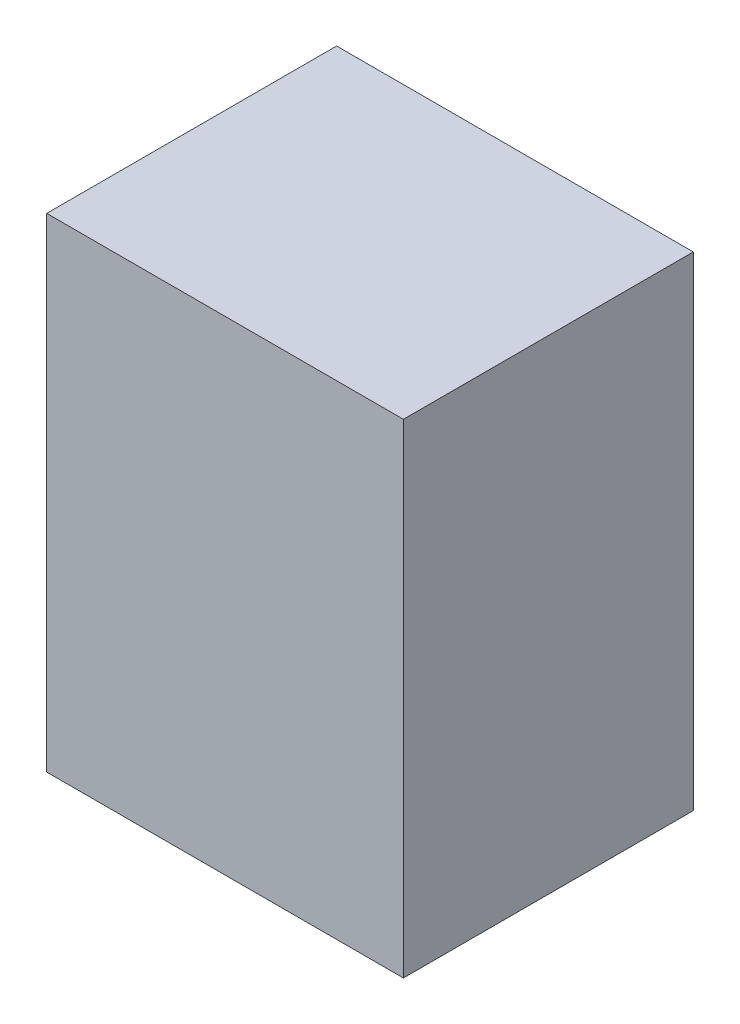
ISO-10303-21;
HEADER;
FILE_DESCRIPTION(('STEP AP214'),'2;1');
FILE_NAME('part.step','',(''),(''),'','','');
FILE_SCHEMA(('AUTOMOTIVE_DESIGN { 1 0 10303 214 1 1 1 1 }'));
ENDSEC;
DATA;
#1=APPLICATION_CONTEXT('core data for automotive mechanical design processes');
#2=APPLICATION_PROTOCOL_DEFINITION('international standard','automotive_design',2000,#1);
#3=PRODUCT_CONTEXT('',#1,'mechanical');
#4=PRODUCT('Part','Part','',(#3));
#5=PRODUCT_RELATED_PRODUCT_CATEGORY('part','',(#4));
#6=PRODUCT_DEFINITION_FORMATION('','',#4);
#7=PRODUCT_DEFINITION_CONTEXT('part definition',#1,'design');
#8=PRODUCT_DEFINITION('design','',#6,#7);
#9=PRODUCT_DEFINITION_SHAPE('','',#8);
#10=(LENGTH_UNIT() NAMED_UNIT(*) SI_UNIT(.MILLI.,.METRE.));
#11=(NAMED_UNIT(*) PLANE_ANGLE_UNIT() SI_UNIT($,.RADIAN.));
#12=(NAMED_UNIT(*) SI_UNIT($,.STERADIAN.) SOLID_ANGLE_UNIT());
#13=UNCERTAINTY_MEASURE_WITH_UNIT(LENGTH_MEASURE(1.E-05),#10,'distance_accuracy_value','');
#14=(GEOMETRIC_REPRESENTATION_CONTEXT(3) GLOBAL_UNCERTAINTY_ASSIGNED_CONTEXT((#13)) GLOBAL_UNIT_ASSIGNED_CONTEXT((#10,
#11,#12)) REPRESENTATION_CONTEXT('',''));
#15=CARTESIAN_POINT('',(0.,0.,0.));
#16=DIRECTION('',(0.,0.,1.));
#17=DIRECTION('',(1.,0.,0.));
#18=AXIS2_PLACEMENT_3D('',#15,#16,#17);
#19=CARTESIAN_POINT('',(-53.7355,77.5714301256037,7.25));
#20=DIRECTION('',(0.,1.,0.));
#21=DIRECTION('',(0.,0.,1.));
#22=AXIS2_PLACEMENT_3D('',#19,#20,#21);
#23=PLANE('',#22);
#24=DIRECTION('',(1.,0.,0.));
#25=VECTOR('',#24,1.);
#26=CARTESIAN_POINT('',(-53.7355,77.5714301256037,0.));
#27=LINE('',#26,#25);
#28=CARTESIAN_POINT('',(-53.7355,77.5714301256037,0.));
#29=VERTEX_POINT('',#28);
#30=CARTESIAN_POINT('',(-44.8155,77.5714301256037,0.));
#31=VERTEX_POINT('',#30);
#32=EDGE_CURVE('E114',#29,#31,#27,.T.);
#33=ORIENTED_EDGE('',*,*,#32,.F.);
#34=DIRECTION('',(0.,0.,-1.));
#35=VECTOR('',#34,1.);
#36=CARTESIAN_POINT('',(-53.7355,77.5714301256037,7.25));
#37=LINE('',#36,#35);
#38=CARTESIAN_POINT('',(-53.7355,77.5714301256037,7.25));
#39=VERTEX_POINT('',#38);
#40=EDGE_CURVE('E11',#39,#29,#37,.T.);
#41=ORIENTED_EDGE('',*,*,#40,.F.);
#42=DIRECTION('',(1.,0.,0.));
#43=VECTOR('',#42,1.);
#44=CARTESIAN_POINT('',(-53.7355,77.5714301256037,7.25));
#45=LINE('',#44,#43);
#46=CARTESIAN_POINT('',(-44.8155,77.5714301256037,7.25));
#47=VERTEX_POINT('',#46);
#48=EDGE_CURVE('E144',#39,#47,#45,.T.);
#49=ORIENTED_EDGE('',*,*,#48,.T.);
#50=DIRECTION('',(0.,0.,-1.));
#51=VECTOR('',#50,1.);
#52=CARTESIAN_POINT('',(-44.8155,77.5714301256037,7.25));
#53=LINE('',#52,#51);
#54=EDGE_CURVE('E36',#47,#31,#53,.T.);
#55=ORIENTED_EDGE('',*,*,#54,.T.);
#56=EDGE_LOOP('',(#33,#41,#49,#55));
#57=FACE_BOUND('',#56,.T.);
#58=ADVANCED_FACE('F33',(#57),#23,.T.);
#59=CARTESIAN_POINT('',(-53.7355,77.5714301256037,7.25));
#60=DIRECTION('',(1.,0.,0.));
#61=DIRECTION('',(0.,0.,-1.));
#62=AXIS2_PLACEMENT_3D('',#59,#60,#61);
#63=PLANE('',#62);
#64=DIRECTION('',(0.,-1.,0.));
#65=VECTOR('',#64,1.);
#66=CARTESIAN_POINT('',(-53.7355,77.5714301256037,0.));
#67=LINE('',#66,#65);
#68=CARTESIAN_POINT('',(-53.7355,65.47,0.));
#69=VERTEX_POINT('',#68);
#70=EDGE_CURVE('E147',#29,#69,#67,.T.);
#71=ORIENTED_EDGE('',*,*,#70,.T.);
#72=DIRECTION('',(0.,0.,-1.));
#73=VECTOR('',#72,1.);
#74=CARTESIAN_POINT('',(-53.7355,65.47,7.25));
#75=LINE('',#74,#73);
#76=CARTESIAN_POINT('',(-53.7355,65.47,7.25));
#77=VERTEX_POINT('',#76);
#78=EDGE_CURVE('E41',#77,#69,#75,.T.);
#79=ORIENTED_EDGE('',*,*,#78,.F.);
#80=DIRECTION('',(0.,-1.,0.));
#81=VECTOR('',#80,1.);
#82=CARTESIAN_POINT('',(-53.7355,77.5714301256037,7.25));
#83=LINE('',#82,#81);
#84=EDGE_CURVE('E151',#39,#77,#83,.T.);
#85=ORIENTED_EDGE('',*,*,#84,.F.);
#86=ORIENTED_EDGE('',*,*,#40,.T.);
#87=EDGE_LOOP('',(#71,#79,#85,#86));
#88=FACE_BOUND('',#87,.T.);
#89=ADVANCED_FACE('F171',(#88),#63,.F.);
#90=CARTESIAN_POINT('',(-53.7355,65.47,7.25));
#91=DIRECTION('',(0.,1.,0.));
#92=DIRECTION('',(0.,0.,1.));
#93=AXIS2_PLACEMENT_3D('',#90,#91,#92);
#94=PLANE('',#93);
#95=DIRECTION('',(1.,0.,0.));
#96=VECTOR('',#95,1.);
#97=CARTESIAN_POINT('',(-53.7355,65.47,0.));
#98=LINE('',#97,#96);
#99=CARTESIAN_POINT('',(-44.8155,65.47,0.));
#100=VERTEX_POINT('',#99);
#101=EDGE_CURVE('E158',#69,#100,#98,.T.);
#102=ORIENTED_EDGE('',*,*,#101,.T.);
#103=DIRECTION('',(0.,0.,-1.));
#104=VECTOR('',#103,1.);
#105=CARTESIAN_POINT('',(-44.8155,65.47,7.25));
#106=LINE('',#105,#104);
#107=CARTESIAN_POINT('',(-44.8155,65.47,7.25));
#108=VERTEX_POINT('',#107);
#109=EDGE_CURVE('E163',#108,#100,#106,.T.);
#110=ORIENTED_EDGE('',*,*,#109,.F.);
#111=DIRECTION('',(1.,0.,0.));
#112=VECTOR('',#111,1.);
#113=CARTESIAN_POINT('',(-53.7355,65.47,7.25));
#114=LINE('',#113,#112);
#115=EDGE_CURVE('E149',#77,#108,#114,.T.);
#116=ORIENTED_EDGE('',*,*,#115,.F.);
#117=ORIENTED_EDGE('',*,*,#78,.T.);
#118=EDGE_LOOP('',(#102,#110,#116,#117));
#119=FACE_BOUND('',#118,.T.);
#120=ADVANCED_FACE('F174',(#119),#94,.F.);
#121=CARTESIAN_POINT('',(-44.8155,77.5714301256037,7.25));
#122=DIRECTION('',(1.,0.,0.));
#123=DIRECTION('',(0.,0.,-1.));
#124=AXIS2_PLACEMENT_3D('',#121,#122,#123);
#125=PLANE('',#124);
#126=DIRECTION('',(0.,-1.,0.));
#127=VECTOR('',#126,1.);
#128=CARTESIAN_POINT('',(-44.8155,77.5714301256037,0.));
#129=LINE('',#128,#127);
#130=EDGE_CURVE('E155',#31,#100,#129,.T.);
#131=ORIENTED_EDGE('',*,*,#130,.F.);
#132=ORIENTED_EDGE('',*,*,#54,.F.);
#133=DIRECTION('',(0.,-1.,0.));
#134=VECTOR('',#133,1.);
#135=CARTESIAN_POINT('',(-44.8155,77.5714301256037,7.25));
#136=LINE('',#135,#134);
#137=EDGE_CURVE('E146',#47,#108,#136,.T.);
#138=ORIENTED_EDGE('',*,*,#137,.T.);
#139=ORIENTED_EDGE('',*,*,#109,.T.);
#140=EDGE_LOOP('',(#131,#132,#138,#139));
#141=FACE_BOUND('',#140,.T.);
#142=ADVANCED_FACE('F166',(#141),#125,.T.);
#143=CARTESIAN_POINT('',(0.,0.,7.25));
#144=DIRECTION('',(0.,0.,-1.));
#145=DIRECTION('',(-1.,0.,0.));
#146=AXIS2_PLACEMENT_3D('',#143,#144,#145);
#147=PLANE('',#146);
#148=ORIENTED_EDGE('',*,*,#48,.F.);
#149=ORIENTED_EDGE('',*,*,#84,.T.);
#150=ORIENTED_EDGE('',*,*,#115,.T.);
#151=ORIENTED_EDGE('',*,*,#137,.F.);
#152=EDGE_LOOP('',(#148,#149,#150,#151));
#153=FACE_BOUND('',#152,.T.);
#154=ADVANCED_FACE('F176',(#153),#147,.F.);
#155=CARTESIAN_POINT('',(0.,0.,0.));
#156=DIRECTION('',(0.,0.,-1.));
#157=DIRECTION('',(-1.,0.,0.));
#158=AXIS2_PLACEMENT_3D('',#155,#156,#157);
#159=PLANE('',#158);
#160=DIRECTION('',(1.,0.,0.));
#161=VECTOR('',#160,1.);
#162=CARTESIAN_POINT('',(0.,77.0714301256037,0.));
#163=LINE('',#162,#161);
#164=CARTESIAN_POINT('',(-53.2355,77.0714301256037,0.));
#165=VERTEX_POINT('',#164);
#166=CARTESIAN_POINT('',(-45.3155,77.0714301256037,0.));
#167=VERTEX_POINT('',#166);
#168=EDGE_CURVE('E138',#165,#167,#163,.T.);
#169=ORIENTED_EDGE('',*,*,#168,.F.);
#170=DIRECTION('',(0.,-1.,0.));
#171=VECTOR('',#170,1.);
#172=CARTESIAN_POINT('',(-53.2355,0.,0.));
#173=LINE('',#172,#171);
#174=CARTESIAN_POINT('',(-53.2355,65.97,0.));
#175=VERTEX_POINT('',#174);
#176=EDGE_CURVE('E109',#165,#175,#173,.T.);
#177=ORIENTED_EDGE('',*,*,#176,.T.);
#178=DIRECTION('',(1.,0.,0.));
#179=VECTOR('',#178,1.);
#180=CARTESIAN_POINT('',(0.,65.97,0.));
#181=LINE('',#180,#179);
#182=CARTESIAN_POINT('',(-45.3155,65.97,0.));
#183=VERTEX_POINT('',#182);
#184=EDGE_CURVE('E49',#175,#183,#181,.T.);
#185=ORIENTED_EDGE('',*,*,#184,.T.);
#186=DIRECTION('',(0.,-1.,0.));
#187=VECTOR('',#186,1.);
#188=CARTESIAN_POINT('',(-45.3155,0.,0.));
#189=LINE('',#188,#187);
#190=EDGE_CURVE('E140',#167,#183,#189,.T.);
#191=ORIENTED_EDGE('',*,*,#190,.F.);
#192=EDGE_LOOP('',(#169,#177,#185,#191));
#193=FACE_BOUND('',#192,.T.);
#194=ORIENTED_EDGE('',*,*,#32,.T.);
#195=ORIENTED_EDGE('',*,*,#130,.T.);
#196=ORIENTED_EDGE('',*,*,#101,.F.);
#197=ORIENTED_EDGE('',*,*,#70,.F.);
#198=EDGE_LOOP('',(#194,#195,#196,#197));
#199=FACE_BOUND('',#198,.T.);
#200=ADVANCED_FACE('F169',(#193,#199),#159,.T.);
#201=CARTESIAN_POINT('',(-53.7355,77.0714301256037,7.25));
#202=DIRECTION('',(0.,1.,0.));
#203=DIRECTION('',(0.,0.,1.));
#204=AXIS2_PLACEMENT_3D('',#201,#202,#203);
#205=PLANE('',#204);
#206=ORIENTED_EDGE('',*,*,#168,.T.);
#207=DIRECTION('',(0.,0.,-1.));
#208=VECTOR('',#207,1.);
#209=CARTESIAN_POINT('',(-45.3155,77.0714301256037,7.25));
#210=LINE('',#209,#208);
#211=CARTESIAN_POINT('',(-45.3155,77.0714301256037,7.05));
#212=VERTEX_POINT('',#211);
#213=EDGE_CURVE('E124',#212,#167,#210,.T.);
#214=ORIENTED_EDGE('',*,*,#213,.F.);
#215=DIRECTION('',(1.,0.,0.));
#216=VECTOR('',#215,1.);
#217=CARTESIAN_POINT('',(0.,77.0714301256037,7.05));
#218=LINE('',#217,#216);
#219=CARTESIAN_POINT('',(-53.2355,77.0714301256037,7.05));
#220=VERTEX_POINT('',#219);
#221=EDGE_CURVE('E122',#220,#212,#218,.T.);
#222=ORIENTED_EDGE('',*,*,#221,.F.);
#223=DIRECTION('',(0.,0.,-1.));
#224=VECTOR('',#223,1.);
#225=CARTESIAN_POINT('',(-53.2355,77.0714301256037,7.25));
#226=LINE('',#225,#224);
#227=EDGE_CURVE('E104',#220,#165,#226,.T.);
#228=ORIENTED_EDGE('',*,*,#227,.T.);
#229=EDGE_LOOP('',(#206,#214,#222,#228));
#230=FACE_BOUND('',#229,.T.);
#231=ADVANCED_FACE('F126',(#230),#205,.F.);
#232=CARTESIAN_POINT('',(-53.2355,77.5714301256037,7.25));
#233=DIRECTION('',(1.,0.,0.));
#234=DIRECTION('',(0.,0.,-1.));
#235=AXIS2_PLACEMENT_3D('',#232,#233,#234);
#236=PLANE('',#235);
#237=ORIENTED_EDGE('',*,*,#176,.F.);
#238=ORIENTED_EDGE('',*,*,#227,.F.);
#239=DIRECTION('',(0.,-1.,0.));
#240=VECTOR('',#239,1.);
#241=CARTESIAN_POINT('',(-53.2355,0.,7.05));
#242=LINE('',#241,#240);
#243=CARTESIAN_POINT('',(-53.2355,65.97,7.05));
#244=VERTEX_POINT('',#243);
#245=EDGE_CURVE('E107',#220,#244,#242,.T.);
#246=ORIENTED_EDGE('',*,*,#245,.T.);
#247=DIRECTION('',(0.,0.,-1.));
#248=VECTOR('',#247,1.);
#249=CARTESIAN_POINT('',(-53.2355,65.97,7.25));
#250=LINE('',#249,#248);
#251=EDGE_CURVE('E115',#244,#175,#250,.T.);
#252=ORIENTED_EDGE('',*,*,#251,.T.);
#253=EDGE_LOOP('',(#237,#238,#246,#252));
#254=FACE_BOUND('',#253,.T.);
#255=ADVANCED_FACE('F106',(#254),#236,.T.);
#256=CARTESIAN_POINT('',(-53.7355,65.97,7.25));
#257=DIRECTION('',(0.,1.,0.));
#258=DIRECTION('',(0.,0.,1.));
#259=AXIS2_PLACEMENT_3D('',#256,#257,#258);
#260=PLANE('',#259);
#261=ORIENTED_EDGE('',*,*,#184,.F.);
#262=ORIENTED_EDGE('',*,*,#251,.F.);
#263=DIRECTION('',(1.,0.,0.));
#264=VECTOR('',#263,1.);
#265=CARTESIAN_POINT('',(0.,65.97,7.05));
#266=LINE('',#265,#264);
#267=CARTESIAN_POINT('',(-45.3155,65.97,7.05));
#268=VERTEX_POINT('',#267);
#269=EDGE_CURVE('E123',#244,#268,#266,.T.);
#270=ORIENTED_EDGE('',*,*,#269,.T.);
#271=DIRECTION('',(0.,0.,-1.));
#272=VECTOR('',#271,1.);
#273=CARTESIAN_POINT('',(-45.3155,65.97,7.25));
#274=LINE('',#273,#272);
#275=EDGE_CURVE('E134',#268,#183,#274,.T.);
#276=ORIENTED_EDGE('',*,*,#275,.T.);
#277=EDGE_LOOP('',(#261,#262,#270,#276));
#278=FACE_BOUND('',#277,.T.);
#279=ADVANCED_FACE('F228',(#278),#260,.T.);
#280=CARTESIAN_POINT('',(-45.3155,77.5714301256037,7.25));
#281=DIRECTION('',(1.,0.,0.));
#282=DIRECTION('',(0.,0.,-1.));
#283=AXIS2_PLACEMENT_3D('',#280,#281,#282);
#284=PLANE('',#283);
#285=ORIENTED_EDGE('',*,*,#190,.T.);
#286=ORIENTED_EDGE('',*,*,#275,.F.);
#287=DIRECTION('',(0.,-1.,0.));
#288=VECTOR('',#287,1.);
#289=CARTESIAN_POINT('',(-45.3155,0.,7.05));
#290=LINE('',#289,#288);
#291=EDGE_CURVE('E128',#212,#268,#290,.T.);
#292=ORIENTED_EDGE('',*,*,#291,.F.);
#293=ORIENTED_EDGE('',*,*,#213,.T.);
#294=EDGE_LOOP('',(#285,#286,#292,#293));
#295=FACE_BOUND('',#294,.T.);
#296=ADVANCED_FACE('F237',(#295),#284,.F.);
#297=CARTESIAN_POINT('',(0.,0.,7.05));
#298=DIRECTION('',(0.,0.,-1.));
#299=DIRECTION('',(-1.,0.,0.));
#300=AXIS2_PLACEMENT_3D('',#297,#298,#299);
#301=PLANE('',#300);
#302=ORIENTED_EDGE('',*,*,#221,.T.);
#303=ORIENTED_EDGE('',*,*,#291,.T.);
#304=ORIENTED_EDGE('',*,*,#269,.F.);
#305=ORIENTED_EDGE('',*,*,#245,.F.);
#306=EDGE_LOOP('',(#302,#303,#304,#305));
#307=FACE_BOUND('',#306,.T.);
#308=ADVANCED_FACE('F120',(#307),#301,.T.);
#309=CLOSED_SHELL('',(#58,#89,#120,#142,#154,#200,#231,#255,#279,#296,#308));
#310=MANIFOLD_SOLID_BREP('B2',#309);
#311=ADVANCED_BREP_SHAPE_REPRESENTATION('',(#18,#310),#14);
#312=SHAPE_DEFINITION_REPRESENTATION(#9,#311);
ENDSEC;
END-ISO-10303-21;
